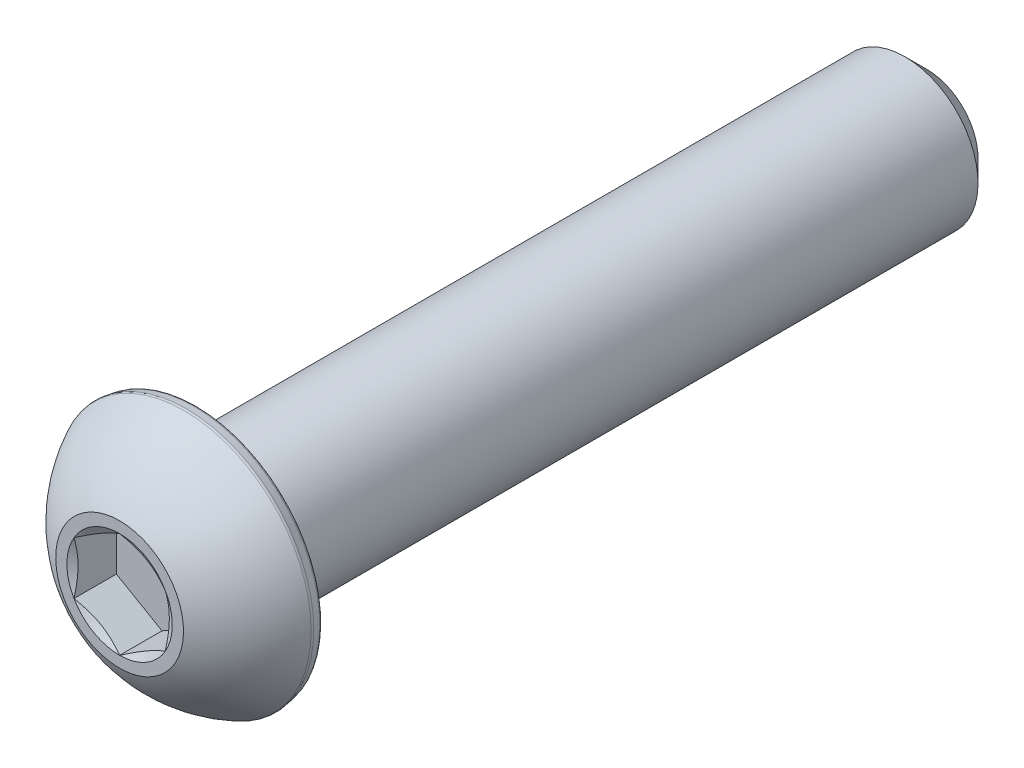
ISO-10303-21;
HEADER;
FILE_DESCRIPTION(('STEP AP214'),'2;1');
FILE_NAME('part.step','',(''),(''),'','','');
FILE_SCHEMA(('AUTOMOTIVE_DESIGN { 1 0 10303 214 1 1 1 1 }'));
ENDSEC;
DATA;
#1=APPLICATION_CONTEXT('core data for automotive mechanical design processes');
#2=APPLICATION_PROTOCOL_DEFINITION('international standard','automotive_design',2000,#1);
#3=PRODUCT_CONTEXT('',#1,'mechanical');
#4=PRODUCT('Part','Part','',(#3));
#5=PRODUCT_RELATED_PRODUCT_CATEGORY('part','',(#4));
#6=PRODUCT_DEFINITION_FORMATION('','',#4);
#7=PRODUCT_DEFINITION_CONTEXT('part definition',#1,'design');
#8=PRODUCT_DEFINITION('design','',#6,#7);
#9=PRODUCT_DEFINITION_SHAPE('','',#8);
#10=(LENGTH_UNIT() NAMED_UNIT(*) SI_UNIT(.MILLI.,.METRE.));
#11=(NAMED_UNIT(*) PLANE_ANGLE_UNIT() SI_UNIT($,.RADIAN.));
#12=(NAMED_UNIT(*) SI_UNIT($,.STERADIAN.) SOLID_ANGLE_UNIT());
#13=UNCERTAINTY_MEASURE_WITH_UNIT(LENGTH_MEASURE(1.E-05),#10,'distance_accuracy_value','');
#14=(GEOMETRIC_REPRESENTATION_CONTEXT(3) GLOBAL_UNCERTAINTY_ASSIGNED_CONTEXT((#13)) GLOBAL_UNIT_ASSIGNED_CONTEXT((#10,
#11,#12)) REPRESENTATION_CONTEXT('',''));
#15=CARTESIAN_POINT('',(0.,0.,0.));
#16=DIRECTION('',(0.,0.,1.));
#17=DIRECTION('',(1.,0.,0.));
#18=AXIS2_PLACEMENT_3D('',#15,#16,#17);
#19=CARTESIAN_POINT('',(0.,2.2225,-31.75));
#20=DIRECTION('',(0.,0.,-1.));
#21=DIRECTION('',(0.,1.,0.));
#22=AXIS2_PLACEMENT_3D('',#19,#20,#21);
#23=PLANE('',#22);
#24=CARTESIAN_POINT('',(0.,0.,-31.75));
#25=DIRECTION('',(0.,0.,-1.));
#26=DIRECTION('',(0.,1.,0.));
#27=AXIS2_PLACEMENT_3D('',#24,#25,#26);
#28=CIRCLE('',#27,2.2225);
#29=CARTESIAN_POINT('',(0.,2.2225,-31.75));
#30=VERTEX_POINT('',#29);
#31=EDGE_CURVE('E109',#30,#30,#28,.T.);
#32=ORIENTED_EDGE('',*,*,#31,.T.);
#33=EDGE_LOOP('',(#32));
#34=FACE_BOUND('',#33,.T.);
#35=ADVANCED_FACE('F40',(#34),#23,.T.);
#36=CARTESIAN_POINT('',(0.,0.,-31.75));
#37=DIRECTION('',(0.,0.,1.));
#38=DIRECTION('',(0.,-1.,0.));
#39=AXIS2_PLACEMENT_3D('',#36,#37,#38);
#40=CONICAL_SURFACE('',#39,2.2225,0.785398163397445);
#41=CARTESIAN_POINT('',(0.,0.,-30.7975));
#42=DIRECTION('',(0.,0.,-1.));
#43=DIRECTION('',(0.,1.,0.));
#44=AXIS2_PLACEMENT_3D('',#41,#42,#43);
#45=CIRCLE('',#44,3.175);
#46=CARTESIAN_POINT('',(0.,3.175,-30.7975));
#47=VERTEX_POINT('',#46);
#48=EDGE_CURVE('E209',#47,#47,#45,.T.);
#49=ORIENTED_EDGE('',*,*,#48,.T.);
#50=EDGE_LOOP('',(#49));
#51=FACE_BOUND('',#50,.T.);
#52=ORIENTED_EDGE('',*,*,#31,.F.);
#53=EDGE_LOOP('',(#52));
#54=FACE_BOUND('',#53,.T.);
#55=ADVANCED_FACE('F267',(#51,#54),#40,.T.);
#56=CARTESIAN_POINT('',(0.,0.,-31.75));
#57=DIRECTION('',(0.,0.,-1.));
#58=DIRECTION('',(0.,1.,0.));
#59=AXIS2_PLACEMENT_3D('',#56,#57,#58);
#60=CYLINDRICAL_SURFACE('',#59,3.175);
#61=CARTESIAN_POINT('',(0.,0.,0.));
#62=DIRECTION('',(0.,0.,-1.));
#63=DIRECTION('',(0.,1.,0.));
#64=AXIS2_PLACEMENT_3D('',#61,#62,#63);
#65=CIRCLE('',#64,3.175);
#66=CARTESIAN_POINT('',(0.,3.175,0.));
#67=VERTEX_POINT('',#66);
#68=EDGE_CURVE('E210',#67,#67,#65,.T.);
#69=ORIENTED_EDGE('',*,*,#68,.T.);
#70=EDGE_LOOP('',(#69));
#71=FACE_BOUND('',#70,.T.);
#72=ORIENTED_EDGE('',*,*,#48,.F.);
#73=EDGE_LOOP('',(#72));
#74=FACE_BOUND('',#73,.T.);
#75=ADVANCED_FACE('F203',(#71,#74),#60,.T.);
#76=CARTESIAN_POINT('',(0.,5.4612216348621,0.));
#77=DIRECTION('',(0.,0.,-1.));
#78=DIRECTION('',(0.,1.,0.));
#79=AXIS2_PLACEMENT_3D('',#76,#77,#78);
#80=PLANE('',#79);
#81=CARTESIAN_POINT('',(0.,0.,0.));
#82=DIRECTION('',(0.,0.,-1.));
#83=DIRECTION('',(0.,1.,0.));
#84=AXIS2_PLACEMENT_3D('',#81,#82,#83);
#85=CIRCLE('',#84,5.32055497269154);
#86=CARTESIAN_POINT('',(0.,5.32055497269154,0.));
#87=VERTEX_POINT('',#86);
#88=EDGE_CURVE('E11',#87,#87,#85,.T.);
#89=ORIENTED_EDGE('',*,*,#88,.T.);
#90=EDGE_LOOP('',(#89));
#91=FACE_BOUND('',#90,.T.);
#92=ORIENTED_EDGE('',*,*,#68,.F.);
#93=EDGE_LOOP('',(#92));
#94=FACE_BOUND('',#93,.T.);
#95=ADVANCED_FACE('F194',(#91,#94),#80,.T.);
#96=CARTESIAN_POINT('',(0.,0.,0.));
#97=DIRECTION('',(0.,0.,1.));
#98=DIRECTION('',(0.,-1.,0.));
#99=AXIS2_PLACEMENT_3D('',#96,#97,#98);
#100=CONICAL_SURFACE('',#99,5.4612216348621,0.174532925199424);
#101=CARTESIAN_POINT('',(0.,0.,0.449969191541055));
#102=DIRECTION('',(0.,0.,-1.));
#103=DIRECTION('',(0.,1.,0.));
#104=AXIS2_PLACEMENT_3D('',#101,#102,#103);
#105=CIRCLE('',#104,5.54056334381836);
#106=CARTESIAN_POINT('',(0.,5.54056334381836,0.449969191541055));
#107=VERTEX_POINT('',#106);
#108=EDGE_CURVE('E180',#107,#107,#105,.T.);
#109=ORIENTED_EDGE('',*,*,#108,.T.);
#110=EDGE_LOOP('',(#109));
#111=FACE_BOUND('',#110,.T.);
#112=CARTESIAN_POINT('',(0.,0.,0.138529619495922));
#113=DIRECTION('',(0.,0.,-1.));
#114=DIRECTION('',(0.,1.,0.));
#115=AXIS2_PLACEMENT_3D('',#112,#113,#114);
#116=CIRCLE('',#115,5.48564814440651);
#117=CARTESIAN_POINT('',(0.,5.48564814440651,0.138529619495922));
#118=VERTEX_POINT('',#117);
#119=EDGE_CURVE('E107',#118,#118,#116,.F.);
#120=ORIENTED_EDGE('',*,*,#119,.T.);
#121=EDGE_LOOP('',(#120));
#122=FACE_BOUND('',#121,.T.);
#123=ADVANCED_FACE('F188',(#111,#122),#100,.T.);
#124=CARTESIAN_POINT('',(0.,0.,-2.12203183656418));
#125=DIRECTION('',(0.,0.,-1.));
#126=DIRECTION('',(0.,1.,0.));
#127=AXIS2_PLACEMENT_3D('',#124,#125,#126);
#128=SPHERICAL_SURFACE('',#127,6.13936170577054);
#129=CARTESIAN_POINT('',(0.,0.,0.552098767852259));
#130=DIRECTION('',(0.,0.,-1.));
#131=DIRECTION('',(0.,1.,0.));
#132=AXIS2_PLACEMENT_3D('',#129,#130,#131);
#133=CIRCLE('',#132,5.5263720165046);
#134=CARTESIAN_POINT('',(0.,5.52637201650459,0.552098767852259));
#135=VERTEX_POINT('',#134);
#136=EDGE_CURVE('E44',#135,#135,#133,.F.);
#137=CARTESIAN_POINT('',(0.,0.,3.3528));
#138=DIRECTION('',(0.,0.,-1.));
#139=DIRECTION('',(0.,1.,0.));
#140=AXIS2_PLACEMENT_3D('',#137,#138,#139);
#141=CIRCLE('',#140,2.778125);
#142=CARTESIAN_POINT('',(0.,2.77812499999999,3.3528));
#143=VERTEX_POINT('',#142);
#144=EDGE_CURVE('E208',#143,#143,#141,.T.);
#145=CARTESIAN_POINT('',(0.,5.52637201650459,0.552098767852259));
#146=CARTESIAN_POINT('',(0.,5.50825080177499,0.589548307182206));
#147=CARTESIAN_POINT('',(0.,5.48974881162674,0.626813592400267));
#148=CARTESIAN_POINT('',(0.,5.45199117255905,0.700960378875296));
#149=CARTESIAN_POINT('',(0.,5.4327355236396,0.737841880132264));
#150=CARTESIAN_POINT('',(0.,5.39347845909561,0.811205822947783));
#151=CARTESIAN_POINT('',(0.,5.37347704347106,0.847688264506334));
#152=CARTESIAN_POINT('',(0.,5.33273672924781,0.920239019608295));
#153=CARTESIAN_POINT('',(0.,5.31199783064911,0.956307333151706));
#154=CARTESIAN_POINT('',(0.,5.26979111662967,1.02801492366803));
#155=CARTESIAN_POINT('',(0.,5.24832330120894,1.06365420064094));
#156=CARTESIAN_POINT('',(0.,5.20466762693299,1.1344889898225));
#157=CARTESIAN_POINT('',(0.,5.18247976807778,1.16968450203113));
#158=CARTESIAN_POINT('',(0.,5.13739317629117,1.23961721606985));
#159=CARTESIAN_POINT('',(0.,5.11449444335977,1.27435441789994));
#160=CARTESIAN_POINT('',(0.,5.06799556699608,1.34335615519477));
#161=CARTESIAN_POINT('',(0.,5.04439542356379,1.37762069065952));
#162=CARTESIAN_POINT('',(0.,4.9965034795341,1.44566293451962));
#163=CARTESIAN_POINT('',(0.,4.9722116789367,1.47944064291497));
#164=CARTESIAN_POINT('',(0.,4.9229464597884,1.54649527314161));
#165=CARTESIAN_POINT('',(0.,4.89797304123748,1.5797721949729));
#166=CARTESIAN_POINT('',(0.,4.84735490708145,1.64581149953536));
#167=CARTESIAN_POINT('',(0.,4.82171019147632,1.67857388226652));
#168=CARTESIAN_POINT('',(0.,4.76976006154396,1.74357056874015));
#169=CARTESIAN_POINT('',(0.,4.74345464721672,1.77580487248262));
#170=CARTESIAN_POINT('',(0.,4.69019399122224,1.83973207933209));
#171=CARTESIAN_POINT('',(0.,4.66323874955498,1.87142498243909));
#172=CARTESIAN_POINT('',(0.,4.6086895788204,1.93425629011852));
#173=CARTESIAN_POINT('',(0.,4.58109564975306,1.96539469469096));
#174=CARTESIAN_POINT('',(0.,4.52528050811203,2.02710413656277));
#175=CARTESIAN_POINT('',(0.,4.49705929553834,2.05767517386215));
#176=CARTESIAN_POINT('',(0.,4.44000125001922,2.11823724692835));
#177=CARTESIAN_POINT('',(0.,4.41116441707378,2.14822828269517));
#178=CARTESIAN_POINT('',(0.,4.35288704836658,2.20761795813715));
#179=CARTESIAN_POINT('',(0.,4.32344651260481,2.23701659781231));
#180=CARTESIAN_POINT('',(0.,4.2639739053159,2.29520933133461));
#181=CARTESIAN_POINT('',(0.,4.23394183378876,2.32400342518176));
#182=CARTESIAN_POINT('',(0.,4.17329856648729,2.38097516715566));
#183=CARTESIAN_POINT('',(0.,4.14268737071296,2.40915281528241));
#184=CARTESIAN_POINT('',(0.,4.08089850577313,2.46488002068504));
#185=CARTESIAN_POINT('',(0.,4.04972083660764,2.49242957796091));
#186=CARTESIAN_POINT('',(0.,3.98681190985103,2.54688921610578));
#187=CARTESIAN_POINT('',(0.,3.95508065225992,2.57379929697477));
#188=CARTESIAN_POINT('',(0.,3.89107766240224,2.62696886102995));
#189=CARTESIAN_POINT('',(0.,3.85880593013566,2.65322834421614));
#190=CARTESIAN_POINT('',(0.,3.79373532804181,2.70508586050525));
#191=CARTESIAN_POINT('',(0.,3.76093645821453,2.73068389360817));
#192=CARTESIAN_POINT('',(0.,3.69482513596821,2.78120793069356));
#193=CARTESIAN_POINT('',(0.,3.66151268354917,2.80613393467603));
#194=CARTESIAN_POINT('',(0.,3.59438796333499,2.8553036122083));
#195=CARTESIAN_POINT('',(0.,3.56057569553984,2.87954728575809));
#196=CARTESIAN_POINT('',(0.,3.49246531836684,2.92734228313378));
#197=CARTESIAN_POINT('',(0.,3.45816720898898,2.95089360695968));
#198=CARTESIAN_POINT('',(0.,3.3890993231695,2.99729417161336));
#199=CARTESIAN_POINT('',(0.,3.35432954672786,3.02014341244114));
#200=CARTESIAN_POINT('',(0.,3.28433269645534,3.06513036840404));
#201=CARTESIAN_POINT('',(0.,3.24910562262445,3.08726808353916));
#202=CARTESIAN_POINT('',(0.,3.17820873538992,3.13082283788848));
#203=CARTESIAN_POINT('',(0.,3.14253892198628,3.15223987710268));
#204=CARTESIAN_POINT('',(0.,3.07077129956019,3.19434443315283));
#205=CARTESIAN_POINT('',(0.,3.03467349053774,3.21503194998879));
#206=CARTESIAN_POINT('',(0.,2.96206478589976,3.25566889417563));
#207=CARTESIAN_POINT('',(0.,2.92555389028423,3.27561832152652));
#208=CARTESIAN_POINT('',(0.,2.8521341362735,3.31477090731015));
#209=CARTESIAN_POINT('',(0.,2.81522527787831,3.33397406574288));
#210=CARTESIAN_POINT('',(0.,2.77812499999999,3.3528));
#211=B_SPLINE_CURVE_WITH_KNOTS('',3,(#145,#146,#147,#148,#149,#150,#151,#152,#153,#154,#155,
#156,#157,#158,#159,#160,#161,#162,#163,#164,#165,#166,#167,#168,#169,#170,#171,#172,#173,#174,
#175,#176,#177,#178,#179,#180,#181,#182,#183,#184,#185,#186,#187,#188,#189,#190,#191,#192,#193,
#194,#195,#196,#197,#198,#199,#200,#201,#202,#203,#204,#205,#206,#207,#208,#209,#210),
.UNSPECIFIED.,.F.,.F.,(4,2,2,2,2,2,2,2,2,2,2,2,2,2,2,2,2,2,2,2,2,2,2,2,2,2,2,2,2,2,2,2,4),(0.,
0.124808174209305,0.24961634841861,0.374424522627915,0.49923269683722,0.624040871046526,
0.748849045255831,0.873657219465135,0.998465393674441,1.12327356788375,1.24808174209305,
1.37288991630236,1.49769809051166,1.62250626472097,1.74731443893027,1.87212261313958,
1.99693078734888,2.12173896155819,2.24654713576749,2.3713553099768,2.4961634841861,
2.62097165839541,2.74577983260471,2.87058800681402,2.99539618102332,3.12020435523263,
3.24501252944193,3.36982070365124,3.49462887786054,3.61943705206985,3.74424522627915,
3.86905340048846,3.99386157469776),.UNSPECIFIED.);
#212=EDGE_CURVE('BSEAM185',#135,#143,#211,.T.);
#213=ORIENTED_EDGE('',*,*,#136,.T.);
#214=ORIENTED_EDGE('',*,*,#144,.T.);
#215=ORIENTED_EDGE('',*,*,#212,.T.);
#216=ORIENTED_EDGE('',*,*,#212,.F.);
#217=EDGE_LOOP('',(#213,#215,#214,#216));
#218=FACE_BOUND('',#217,.T.);
#219=ADVANCED_FACE('F185',(#218),#128,.T.);
#220=CARTESIAN_POINT('',(0.,0.,3.3528));
#221=DIRECTION('',(0.,0.,1.));
#222=DIRECTION('',(0.,-1.,0.));
#223=AXIS2_PLACEMENT_3D('',#220,#221,#222);
#224=PLANE('',#223);
#225=CARTESIAN_POINT('',(0.,0.,3.3528));
#226=DIRECTION('',(0.,0.,1.));
#227=DIRECTION('',(1.,0.,0.));
#228=AXIS2_PLACEMENT_3D('',#225,#226,#227);
#229=CIRCLE('',#228,2.29135888084633);
#230=CARTESIAN_POINT('',(0.,-2.29135888084633,3.3528));
#231=VERTEX_POINT('',#230);
#232=CARTESIAN_POINT('',(1.984375,-1.14567944042316,3.3528));
#233=VERTEX_POINT('',#232);
#234=EDGE_CURVE('E59',#231,#233,#229,.T.);
#235=ORIENTED_EDGE('',*,*,#234,.F.);
#236=CARTESIAN_POINT('',(-1.984375,-1.14567944042316,3.3528));
#237=VERTEX_POINT('',#236);
#238=EDGE_CURVE('E133',#237,#231,#229,.T.);
#239=ORIENTED_EDGE('',*,*,#238,.F.);
#240=CARTESIAN_POINT('',(-1.984375,1.14567944042316,3.3528));
#241=VERTEX_POINT('',#240);
#242=EDGE_CURVE('E131',#241,#237,#229,.T.);
#243=ORIENTED_EDGE('',*,*,#242,.F.);
#244=CARTESIAN_POINT('',(0.,2.29135888084633,3.3528));
#245=VERTEX_POINT('',#244);
#246=EDGE_CURVE('E100',#245,#241,#229,.T.);
#247=ORIENTED_EDGE('',*,*,#246,.F.);
#248=CARTESIAN_POINT('',(1.984375,1.14567944042316,3.3528));
#249=VERTEX_POINT('',#248);
#250=EDGE_CURVE('E87',#249,#245,#229,.T.);
#251=ORIENTED_EDGE('',*,*,#250,.F.);
#252=EDGE_CURVE('E51',#233,#249,#229,.T.);
#253=ORIENTED_EDGE('',*,*,#252,.F.);
#254=EDGE_LOOP('',(#235,#239,#243,#247,#251,#253));
#255=FACE_BOUND('',#254,.T.);
#256=ORIENTED_EDGE('',*,*,#144,.F.);
#257=EDGE_LOOP('',(#256));
#258=FACE_BOUND('',#257,.T.);
#259=ADVANCED_FACE('F128',(#255,#258),#224,.T.);
#260=CARTESIAN_POINT('',(0.,0.,3.3528));
#261=DIRECTION('',(0.,0.,1.));
#262=DIRECTION('',(1.,0.,0.));
#263=AXIS2_PLACEMENT_3D('',#260,#261,#262);
#264=CONICAL_SURFACE('',#263,2.29135888084633,1.0471975511966);
#265=ORIENTED_EDGE('',*,*,#246,.T.);
#266=CARTESIAN_POINT('',(0.000199999999998985,2.29147435090016,3.35286667170578));
#267=CARTESIAN_POINT('',(-0.0870046387806774,2.24112672922556,3.32378568224019));
#268=CARTESIAN_POINT('',(-0.174962019304997,2.19034451190263,3.29733720802705));
#269=CARTESIAN_POINT('',(-0.35239997867232,2.08790065829744,3.25117027120647));
#270=CARTESIAN_POINT('',(-0.441883711256319,2.03623720120198,3.23146814224896));
#271=CARTESIAN_POINT('',(-0.619742148012469,1.93355058486317,3.20079773193153));
#272=CARTESIAN_POINT('',(-0.708089480306093,1.88254322878126,3.18962534272021));
#273=CARTESIAN_POINT('',(-0.885200028110949,1.7802884063298,3.17628579605442));
#274=CARTESIAN_POINT('',(-0.973962599510546,1.72904131183828,3.17410759446012));
#275=CARTESIAN_POINT('',(-1.13983230286466,1.63327639395638,3.17862955150835));
#276=CARTESIAN_POINT('',(-1.21696421566591,1.58874426333747,3.18421941345587));
#277=CARTESIAN_POINT('',(-1.37072550718908,1.49997014028562,3.20193893389701));
#278=CARTESIAN_POINT('',(-1.44735435374552,1.45572845509857,3.21407465032952));
#279=CARTESIAN_POINT('',(-1.60143288850678,1.36677117157781,3.24441415884436));
#280=CARTESIAN_POINT('',(-1.67886306721268,1.32206683705856,3.26274660929099));
#281=CARTESIAN_POINT('',(-1.83256831124359,1.23332507304146,3.30435450640018));
#282=CARTESIAN_POINT('',(-1.90884534705293,1.18928650588395,3.32762017128238));
#283=CARTESIAN_POINT('',(-1.984575,1.14556397036932,3.35286667170578));
#284=B_SPLINE_CURVE_WITH_KNOTS('',3,(#266,#267,#268,#269,#270,#271,#272,#273,#274,#275,#276,
#277,#278,#279,#280,#281,#282,#283),.UNSPECIFIED.,.F.,.F.,(4,2,2,2,2,2,2,2,4),(0.,
0.314555137114085,0.629866549668806,0.937373439505932,1.24450262309398,1.51196650590478,
1.77967834211415,2.05332989762155,2.32644383656793),.UNSPECIFIED.);
#285=EDGE_CURVE('E104',#245,#241,#284,.T.);
#286=ORIENTED_EDGE('',*,*,#285,.F.);
#287=EDGE_LOOP('',(#265,#286));
#288=FACE_BOUND('',#287,.T.);
#289=ADVANCED_FACE('F102',(#288),#264,.F.);
#290=ORIENTED_EDGE('',*,*,#242,.T.);
#291=CARTESIAN_POINT('',(-1.984375,-2.96692860034507,4.09066065109238));
#292=CARTESIAN_POINT('',(-1.984375,-2.88123645369667,4.04954880177529));
#293=CARTESIAN_POINT('',(-1.984375,-2.79533554929687,4.00886397295606));
#294=CARTESIAN_POINT('',(-1.984375,-2.62300496253372,3.92859059794519));
#295=CARTESIAN_POINT('',(-1.984375,-2.53657518838115,3.88900224904708));
#296=CARTESIAN_POINT('',(-1.984375,-2.36258003650985,3.8109429144296));
#297=CARTESIAN_POINT('',(-1.984375,-2.27501095051754,3.77248016339895));
#298=CARTESIAN_POINT('',(-1.984375,-2.09913795632987,3.69727942709752));
#299=CARTESIAN_POINT('',(-1.984375,-2.01083408662377,3.66054135214645));
#300=CARTESIAN_POINT('',(-1.984375,-1.83102497893539,3.58831372935496));
#301=CARTESIAN_POINT('',(-1.984375,-1.73949640320228,3.55288193907389));
#302=CARTESIAN_POINT('',(-1.984375,-1.55533214713673,3.48496418355678));
#303=CARTESIAN_POINT('',(-1.984375,-1.46269633980312,3.45247855999265));
#304=CARTESIAN_POINT('',(-1.984375,-1.27638419434466,3.39138213635921));
#305=CARTESIAN_POINT('',(-1.984375,-1.18271082678456,3.3627623752382));
#306=CARTESIAN_POINT('',(-1.984375,-0.994021652382588,3.31037636886058));
#307=CARTESIAN_POINT('',(-1.984375,-0.899006185229732,3.28660891819845));
#308=CARTESIAN_POINT('',(-1.984375,-0.70783051245842,3.24519473938057));
#309=CARTESIAN_POINT('',(-1.984375,-0.611673084373239,3.22753544006603));
#310=CARTESIAN_POINT('',(-1.984375,-0.418283092113672,3.19949309653349));
#311=CARTESIAN_POINT('',(-1.984375,-0.32105060104525,3.18910956060593));
#312=CARTESIAN_POINT('',(-1.984375,-0.127210752774483,3.1765852009906));
#313=CARTESIAN_POINT('',(-1.984375,-0.0306098639781233,3.17434710736856));
#314=CARTESIAN_POINT('',(-1.984375,0.162431915887106,3.17804204703217));
#315=CARTESIAN_POINT('',(-1.984375,0.258872796678698,3.18397558627506));
#316=CARTESIAN_POINT('',(-1.984375,0.496826477184734,3.20817557369152));
#317=CARTESIAN_POINT('',(-1.984375,0.637878211825128,3.23097722021417));
#318=CARTESIAN_POINT('',(-1.984375,0.917238703702529,3.28977602426137));
#319=CARTESIAN_POINT('',(-1.984375,1.05554394232965,3.32578908554252));
#320=CARTESIAN_POINT('',(-1.984375,1.26239464896717,3.38730820789035));
#321=CARTESIAN_POINT('',(-1.984375,1.33200934564274,3.40935142641455));
#322=CARTESIAN_POINT('',(-1.984375,1.47051409380588,3.4554769862575));
#323=CARTESIAN_POINT('',(-1.984375,1.53940456776433,3.47955805500612));
#324=CARTESIAN_POINT('',(-1.984375,1.67655293465251,3.52940958868946));
#325=CARTESIAN_POINT('',(-1.984375,1.74481093998431,3.55517974660228));
#326=CARTESIAN_POINT('',(-1.984375,1.88078910071683,3.60813071268156));
#327=CARTESIAN_POINT('',(-1.984375,1.94850916300286,3.63531175918296));
#328=CARTESIAN_POINT('',(-1.984375,2.12136731788458,3.70643362383593));
#329=CARTESIAN_POINT('',(-1.984375,2.22615977384556,3.75121359670133));
#330=CARTESIAN_POINT('',(-1.984375,2.43479837304526,3.84293219568247));
#331=CARTESIAN_POINT('',(-1.984375,2.5386444446916,3.88987098351125));
#332=CARTESIAN_POINT('',(-1.984375,2.84907841644385,4.03316456132352));
#333=CARTESIAN_POINT('',(-1.984375,3.05452739791262,4.13198187526435));
#334=CARTESIAN_POINT('',(-1.984375,3.46367014223902,4.33376088572476));
#335=CARTESIAN_POINT('',(-1.984375,3.66736143684957,4.43672752775299));
#336=CARTESIAN_POINT('',(-1.984375,4.0733484486621,4.64530841655482));
#337=CARTESIAN_POINT('',(-1.984375,4.27564433912762,4.75092232679349));
#338=CARTESIAN_POINT('',(-1.984375,4.66022184962415,4.95391933686162));
#339=CARTESIAN_POINT('',(-1.984375,4.84259034249047,5.05113842729249));
#340=CARTESIAN_POINT('',(-1.984375,5.20674070245669,5.24668432048827));
#341=CARTESIAN_POINT('',(-1.984375,5.3885225475248,5.34501116424655));
#342=CARTESIAN_POINT('',(-1.984375,5.7511724793118,5.54224361750704));
#343=CARTESIAN_POINT('',(-1.984375,5.93204171415672,5.6411471187779));
#344=CARTESIAN_POINT('',(-1.984375,6.29341450955435,5.83959783989033));
#345=CARTESIAN_POINT('',(-1.984375,6.47391808874827,5.9391450257738));
#346=CARTESIAN_POINT('',(-1.984375,6.65429029614519,6.03892825226339));
#347=B_SPLINE_CURVE_WITH_KNOTS('',3,(#291,#292,#293,#294,#295,#296,#297,#298,#299,#300,#301,
#302,#303,#304,#305,#306,#307,#308,#309,#310,#311,#312,#313,#314,#315,#316,#317,#318,#319,#320,
#321,#322,#323,#324,#325,#326,#327,#328,#329,#330,#331,#332,#333,#334,#335,#336,#337,#338,#339,
#340,#341,#342,#343,#344,#345,#346),.UNSPECIFIED.,.F.,.F.,(4,2,2,2,2,2,2,2,2,2,2,2,2,2,2,2,2,2,
2,2,2,2,2,2,2,2,2,4),(0.,0.285135519832374,0.570322016122789,0.857238463819793,1.14413997577449,
1.43854271801315,1.7329795590899,2.02672173491208,2.32039085060263,2.61345191984504,
2.90649318156653,3.19602335108128,3.48557144803805,3.91334047285799,4.34162614021154,
4.56066589824458,4.77956986852721,4.99843415889189,5.21733554208812,5.55917796423187,
5.90104603503021,6.58489509249957,7.26958483186157,7.95418796687477,8.57417425374277,
9.1941835596094,9.81261585701216,10.431015790458),.UNSPECIFIED.);
#348=EDGE_CURVE('E96',#241,#237,#347,.F.);
#349=ORIENTED_EDGE('',*,*,#348,.F.);
#350=EDGE_LOOP('',(#290,#349));
#351=FACE_BOUND('',#350,.T.);
#352=ADVANCED_FACE('F284',(#351),#264,.F.);
#353=ORIENTED_EDGE('',*,*,#238,.T.);
#354=CARTESIAN_POINT('',(-1.984575,-1.14556397036933,3.35286667170578));
#355=CARTESIAN_POINT('',(-1.89737036121932,-1.19591159204393,3.32378568224019));
#356=CARTESIAN_POINT('',(-1.809412980695,-1.24669380936686,3.29733720802705));
#357=CARTESIAN_POINT('',(-1.63197502132768,-1.34913766297205,3.25117027120647));
#358=CARTESIAN_POINT('',(-1.54249128874368,-1.40080112006751,3.23146814224896));
#359=CARTESIAN_POINT('',(-1.36463285198753,-1.50348773640632,3.20079773193153));
#360=CARTESIAN_POINT('',(-1.27628551969391,-1.55449509248823,3.18962534272021));
#361=CARTESIAN_POINT('',(-1.09917497188905,-1.65674991493968,3.17628579605442));
#362=CARTESIAN_POINT('',(-1.01041240048945,-1.7079970094312,3.17410759446012));
#363=CARTESIAN_POINT('',(-0.844542697135338,-1.80376192731311,3.17862955150835));
#364=CARTESIAN_POINT('',(-0.767410784334092,-1.84829405793202,3.18421941345587));
#365=CARTESIAN_POINT('',(-0.613649492810918,-1.93706818098386,3.20193893389701));
#366=CARTESIAN_POINT('',(-0.537020646254475,-1.98130986617092,3.21407465032952));
#367=CARTESIAN_POINT('',(-0.382942111493216,-2.07026714969167,3.24441415884436));
#368=CARTESIAN_POINT('',(-0.305511932787316,-2.11497148421093,3.26274660929099));
#369=CARTESIAN_POINT('',(-0.15180668875641,-2.20371324822803,3.30435450640018));
#370=CARTESIAN_POINT('',(-0.075529652947066,-2.24775181538554,3.32762017128238));
#371=CARTESIAN_POINT('',(0.000200000000001756,-2.29147435090016,3.35286667170578));
#372=B_SPLINE_CURVE_WITH_KNOTS('',3,(#354,#355,#356,#357,#358,#359,#360,#361,#362,#363,#364,
#365,#366,#367,#368,#369,#370,#371),.UNSPECIFIED.,.F.,.F.,(4,2,2,2,2,2,2,2,4),(0.,
0.314555137114085,0.629866549668806,0.937373439505933,1.24450262309398,1.51196650590478,
1.77967834211415,2.05332989762155,2.32644383656793),.UNSPECIFIED.);
#373=EDGE_CURVE('E143',#237,#231,#372,.T.);
#374=ORIENTED_EDGE('',*,*,#373,.F.);
#375=EDGE_LOOP('',(#353,#374));
#376=FACE_BOUND('',#375,.T.);
#377=ADVANCED_FACE('F289',(#376),#264,.F.);
#378=ORIENTED_EDGE('',*,*,#234,.T.);
#379=CARTESIAN_POINT('',(-0.000199999999998362,-2.29147435090016,3.35286667170578));
#380=CARTESIAN_POINT('',(0.0870046387806782,-2.24112672922556,3.32378568224019));
#381=CARTESIAN_POINT('',(0.174962019304998,-2.19034451190263,3.29733720802705));
#382=CARTESIAN_POINT('',(0.352399978672321,-2.08790065829744,3.25117027120647));
#383=CARTESIAN_POINT('',(0.44188371125632,-2.03623720120198,3.23146814224896));
#384=CARTESIAN_POINT('',(0.619742148012469,-1.93355058486317,3.20079773193153));
#385=CARTESIAN_POINT('',(0.708089480306094,-1.88254322878126,3.18962534272021));
#386=CARTESIAN_POINT('',(0.88520002811095,-1.78028840632981,3.17628579605442));
#387=CARTESIAN_POINT('',(0.973962599510547,-1.72904131183828,3.17410759446012));
#388=CARTESIAN_POINT('',(1.13983230286466,-1.63327639395638,3.17862955150835));
#389=CARTESIAN_POINT('',(1.21696421566591,-1.58874426333747,3.18421941345587));
#390=CARTESIAN_POINT('',(1.37072550718908,-1.49997014028562,3.20193893389701));
#391=CARTESIAN_POINT('',(1.44735435374552,-1.45572845509857,3.21407465032952));
#392=CARTESIAN_POINT('',(1.60143288850678,-1.36677117157782,3.24441415884436));
#393=CARTESIAN_POINT('',(1.67886306721268,-1.32206683705856,3.26274660929099));
#394=CARTESIAN_POINT('',(1.83256831124359,-1.23332507304146,3.30435450640018));
#395=CARTESIAN_POINT('',(1.90884534705293,-1.18928650588395,3.32762017128238));
#396=CARTESIAN_POINT('',(1.984575,-1.14556397036933,3.35286667170578));
#397=B_SPLINE_CURVE_WITH_KNOTS('',3,(#379,#380,#381,#382,#383,#384,#385,#386,#387,#388,#389,
#390,#391,#392,#393,#394,#395,#396),.UNSPECIFIED.,.F.,.F.,(4,2,2,2,2,2,2,2,4),(0.,
0.314555137114086,0.629866549668806,0.937373439505932,1.24450262309398,1.51196650590478,
1.77967834211415,2.05332989762155,2.32644383656793),.UNSPECIFIED.);
#398=EDGE_CURVE('E247',#231,#233,#397,.T.);
#399=ORIENTED_EDGE('',*,*,#398,.F.);
#400=EDGE_LOOP('',(#378,#399));
#401=FACE_BOUND('',#400,.T.);
#402=ADVANCED_FACE('F298',(#401),#264,.F.);
#403=ORIENTED_EDGE('',*,*,#252,.T.);
#404=CARTESIAN_POINT('',(1.984375,-2.96692860141219,4.09066065160449));
#405=CARTESIAN_POINT('',(1.984375,-2.88123645472732,4.04954880226534));
#406=CARTESIAN_POINT('',(1.984375,-2.79533555029103,4.00886397342406));
#407=CARTESIAN_POINT('',(1.984375,-2.62300496345475,3.92859059836923));
#408=CARTESIAN_POINT('',(1.984375,-2.53657518926555,3.88900224944919));
#409=CARTESIAN_POINT('',(1.984375,-2.36258003732029,3.81094291478783));
#410=CARTESIAN_POINT('',(1.984375,-2.27501095129065,3.77248016373523));
#411=CARTESIAN_POINT('',(1.984375,-2.09913795702803,3.69727942739033));
#412=CARTESIAN_POINT('',(1.984375,-2.01083408728431,3.66054135241773));
#413=CARTESIAN_POINT('',(1.984375,-1.83102497951849,3.58831372958307));
#414=CARTESIAN_POINT('',(1.984375,-1.73949640374555,3.55288193928038));
#415=CARTESIAN_POINT('',(1.984375,-1.55533214759963,3.48496418372135));
#416=CARTESIAN_POINT('',(1.984375,-1.46269634022548,3.45247856013692));
#417=CARTESIAN_POINT('',(1.984375,-1.27638419468518,3.39138213646512));
#418=CARTESIAN_POINT('',(1.984375,-1.18271082708378,3.36276237532604));
#419=CARTESIAN_POINT('',(1.984375,-0.994021652598049,3.31037636891564));
#420=CARTESIAN_POINT('',(1.984375,-0.899006185402726,3.28660891823881));
#421=CARTESIAN_POINT('',(1.984375,-0.707830512533289,3.24519473939392));
#422=CARTESIAN_POINT('',(1.984375,-0.611673084392285,3.22753544006783));
#423=CARTESIAN_POINT('',(1.984375,-0.418283092019903,3.19949309652086));
#424=CARTESIAN_POINT('',(1.984375,-0.321050600894491,3.1891095605904));
#425=CARTESIAN_POINT('',(1.984375,-0.1272107525108,3.17658520097928));
#426=CARTESIAN_POINT('',(1.984375,-0.0306098636585145,3.17434710736418));
#427=CARTESIAN_POINT('',(1.984375,0.162431916317516,3.17804204705093));
#428=CARTESIAN_POINT('',(1.984375,0.258872797163983,3.18397558631003));
#429=CARTESIAN_POINT('',(1.984375,0.496826477759218,3.20817557377113));
#430=CARTESIAN_POINT('',(1.984375,0.637878212433304,3.23097722032126));
#431=CARTESIAN_POINT('',(1.984375,0.917238704375943,3.28977602442423));
#432=CARTESIAN_POINT('',(1.984375,1.05554394303461,3.32578908573368));
#433=CARTESIAN_POINT('',(1.984375,1.2623946497194,3.38730820812349));
#434=CARTESIAN_POINT('',(1.984375,1.33200934641104,3.40935142666181));
#435=CARTESIAN_POINT('',(1.984375,1.47051409460615,3.45547698653263));
#436=CARTESIAN_POINT('',(1.984375,1.53940456858051,3.47955805529501));
#437=CARTESIAN_POINT('',(1.984375,1.67655293550043,3.52940958900545));
#438=CARTESIAN_POINT('',(1.984375,1.74481094084806,3.55517974693163));
#439=CARTESIAN_POINT('',(1.984375,1.88078910161224,3.60813071303724));
#440=CARTESIAN_POINT('',(1.984375,1.94850916391411,3.63531175955162));
#441=CARTESIAN_POINT('',(1.984375,2.12136731880634,3.70643362422501));
#442=CARTESIAN_POINT('',(1.984375,2.22615977476235,3.75121359709679));
#443=CARTESIAN_POINT('',(1.984375,2.43479837395273,3.84293219608892));
#444=CARTESIAN_POINT('',(1.984375,2.53864444559471,3.88987098392231));
#445=CARTESIAN_POINT('',(1.984375,2.84907841733456,4.03316456174645));
#446=CARTESIAN_POINT('',(1.984375,3.05452739879602,4.13198187569265));
#447=CARTESIAN_POINT('',(1.984375,3.4636701431087,4.33376088616096));
#448=CARTESIAN_POINT('',(1.984375,3.66736143771284,4.43672752819169));
#449=CARTESIAN_POINT('',(1.984375,4.07334844951337,4.64530841699697));
#450=CARTESIAN_POINT('',(1.984375,4.27564433997329,4.75092232723658));
#451=CARTESIAN_POINT('',(1.984375,4.66022185046472,4.95391933730827));
#452=CARTESIAN_POINT('',(1.984375,4.84259034333148,5.05113842774189));
#453=CARTESIAN_POINT('',(1.984375,5.2067407032988,5.24668432094268));
#454=CARTESIAN_POINT('',(1.984375,5.38852254836759,5.34501116470323));
#455=CARTESIAN_POINT('',(1.984375,5.75117248015673,5.54224361796825));
#456=CARTESIAN_POINT('',(1.984375,5.93204171500312,5.64114711924138));
#457=CARTESIAN_POINT('',(1.984375,6.29341451040382,5.83959784035812));
#458=CARTESIAN_POINT('',(1.984375,6.47391808959935,5.93914502624362));
#459=CARTESIAN_POINT('',(1.984375,6.65429029699792,6.03892825273518));
#460=B_SPLINE_CURVE_WITH_KNOTS('',3,(#404,#405,#406,#407,#408,#409,#410,#411,#412,#413,#414,
#415,#416,#417,#418,#419,#420,#421,#422,#423,#424,#425,#426,#427,#428,#429,#430,#431,#432,#433,
#434,#435,#436,#437,#438,#439,#440,#441,#442,#443,#444,#445,#446,#447,#448,#449,#450,#451,#452,
#453,#454,#455,#456,#457,#458,#459),.UNSPECIFIED.,.F.,.F.,(4,2,2,2,2,2,2,2,2,2,2,2,2,2,2,2,2,2,
2,2,2,2,2,2,2,2,2,4),(0.,0.285135519959645,0.570322016377352,0.857238464203373,1.14413997628707,
1.43854271866057,1.73297955987221,2.02672173582863,2.32039085165331,2.61345192106629,
2.90649318295812,3.1960233526395,3.48557144976305,3.9133404746958,4.34162614216248,
4.56066590025427,4.77956987059558,4.99843416101885,5.21733554427368,5.5591779664113,
5.90104603720346,6.58489509466017,7.26958483400843,7.95418796900807,8.57417425588111,
9.19418356175274,9.81261585916263,10.4310157926157),.UNSPECIFIED.);
#461=EDGE_CURVE('E119',#233,#249,#460,.T.);
#462=ORIENTED_EDGE('',*,*,#461,.F.);
#463=EDGE_LOOP('',(#403,#462));
#464=FACE_BOUND('',#463,.T.);
#465=ADVANCED_FACE('F293',(#464),#264,.F.);
#466=ORIENTED_EDGE('',*,*,#250,.T.);
#467=CARTESIAN_POINT('',(1.984575,1.14556397036933,3.35286667170578));
#468=CARTESIAN_POINT('',(1.89737036121932,1.19591159204393,3.32378568224019));
#469=CARTESIAN_POINT('',(1.809412980695,1.24669380936686,3.29733720802705));
#470=CARTESIAN_POINT('',(1.63197502132768,1.34913766297205,3.25117027120647));
#471=CARTESIAN_POINT('',(1.54249128874368,1.40080112006751,3.23146814224896));
#472=CARTESIAN_POINT('',(1.36463285198753,1.50348773640632,3.20079773193153));
#473=CARTESIAN_POINT('',(1.27628551969391,1.55449509248823,3.18962534272021));
#474=CARTESIAN_POINT('',(1.09917497188905,1.65674991493968,3.17628579605443));
#475=CARTESIAN_POINT('',(1.01041240048945,1.7079970094312,3.17410759446012));
#476=CARTESIAN_POINT('',(0.844542697135338,1.80376192731311,3.17862955150835));
#477=CARTESIAN_POINT('',(0.767410784334093,1.84829405793202,3.18421941345587));
#478=CARTESIAN_POINT('',(0.613649492810918,1.93706818098386,3.20193893389701));
#479=CARTESIAN_POINT('',(0.537020646254475,1.98130986617092,3.21407465032952));
#480=CARTESIAN_POINT('',(0.382942111493216,2.07026714969167,3.24441415884436));
#481=CARTESIAN_POINT('',(0.305511932787317,2.11497148421092,3.26274660929099));
#482=CARTESIAN_POINT('',(0.151806688756411,2.20371324822803,3.30435450640018));
#483=CARTESIAN_POINT('',(0.0755296529470667,2.24775181538554,3.32762017128238));
#484=CARTESIAN_POINT('',(-0.000200000000000885,2.29147435090016,3.35286667170578));
#485=B_SPLINE_CURVE_WITH_KNOTS('',3,(#467,#468,#469,#470,#471,#472,#473,#474,#475,#476,#477,
#478,#479,#480,#481,#482,#483,#484),.UNSPECIFIED.,.F.,.F.,(4,2,2,2,2,2,2,2,4),(0.,
0.314555137114085,0.629866549668806,0.937373439505933,1.24450262309398,1.51196650590478,
1.77967834211415,2.05332989762155,2.32644383656793),.UNSPECIFIED.);
#486=EDGE_CURVE('E91',#249,#245,#485,.T.);
#487=ORIENTED_EDGE('',*,*,#486,.F.);
#488=EDGE_LOOP('',(#466,#487));
#489=FACE_BOUND('',#488,.T.);
#490=ADVANCED_FACE('F95',(#489),#264,.F.);
#491=CARTESIAN_POINT('',(0.,0.,1.50876));
#492=DIRECTION('',(0.,0.,1.));
#493=DIRECTION('',(1.,0.,0.));
#494=AXIS2_PLACEMENT_3D('',#491,#492,#493);
#495=PLANE('',#494);
#496=DIRECTION('',(-0.866025403784439,0.499999999999999,0.));
#497=VECTOR('',#496,1.);
#498=CARTESIAN_POINT('',(1.984375,1.14567944042316,1.50876));
#499=LINE('',#498,#497);
#500=CARTESIAN_POINT('',(1.984375,1.14567944042316,1.50876));
#501=VERTEX_POINT('',#500);
#502=CARTESIAN_POINT('',(0.,2.29135888084633,1.50876));
#503=VERTEX_POINT('',#502);
#504=EDGE_CURVE('E118',#501,#503,#499,.T.);
#505=ORIENTED_EDGE('',*,*,#504,.T.);
#506=DIRECTION('',(-0.866025403784438,-0.5,0.));
#507=VECTOR('',#506,1.);
#508=CARTESIAN_POINT('',(0.,2.29135888084633,1.50876));
#509=LINE('',#508,#507);
#510=CARTESIAN_POINT('',(-1.984375,1.14567944042316,1.50876));
#511=VERTEX_POINT('',#510);
#512=EDGE_CURVE('E121',#503,#511,#509,.T.);
#513=ORIENTED_EDGE('',*,*,#512,.T.);
#514=DIRECTION('',(0.,-1.,0.));
#515=VECTOR('',#514,1.);
#516=CARTESIAN_POINT('',(-1.984375,1.14567944042316,1.50876));
#517=LINE('',#516,#515);
#518=CARTESIAN_POINT('',(-1.984375,-1.14567944042316,1.50876));
#519=VERTEX_POINT('',#518);
#520=EDGE_CURVE('E234',#511,#519,#517,.T.);
#521=ORIENTED_EDGE('',*,*,#520,.T.);
#522=DIRECTION('',(0.866025403784439,-0.499999999999999,0.));
#523=VECTOR('',#522,1.);
#524=CARTESIAN_POINT('',(-1.984375,-1.14567944042316,1.50876));
#525=LINE('',#524,#523);
#526=CARTESIAN_POINT('',(0.,-2.29135888084633,1.50876));
#527=VERTEX_POINT('',#526);
#528=EDGE_CURVE('E233',#519,#527,#525,.T.);
#529=ORIENTED_EDGE('',*,*,#528,.T.);
#530=DIRECTION('',(0.866025403784439,0.5,0.));
#531=VECTOR('',#530,1.);
#532=CARTESIAN_POINT('',(0.,-2.29135888084633,1.50876));
#533=LINE('',#532,#531);
#534=CARTESIAN_POINT('',(1.984375,-1.14567944042316,1.50876));
#535=VERTEX_POINT('',#534);
#536=EDGE_CURVE('E226',#527,#535,#533,.T.);
#537=ORIENTED_EDGE('',*,*,#536,.T.);
#538=DIRECTION('',(0.,1.,0.));
#539=VECTOR('',#538,1.);
#540=CARTESIAN_POINT('',(1.984375,-1.14567944042316,1.50876));
#541=LINE('',#540,#539);
#542=EDGE_CURVE('E130',#535,#501,#541,.T.);
#543=ORIENTED_EDGE('',*,*,#542,.T.);
#544=EDGE_LOOP('',(#505,#513,#521,#529,#537,#543));
#545=FACE_BOUND('',#544,.T.);
#546=ADVANCED_FACE('F164',(#545),#495,.T.);
#547=CARTESIAN_POINT('',(0.,2.29135888084633,1.50876));
#548=DIRECTION('',(-0.500000000000001,0.866025403784438,0.));
#549=DIRECTION('',(-0.866025403784438,-0.500000000000001,0.));
#550=AXIS2_PLACEMENT_3D('',#547,#548,#549);
#551=PLANE('',#550);
#552=DIRECTION('',(0.,0.,1.));
#553=VECTOR('',#552,1.);
#554=CARTESIAN_POINT('',(0.,2.29135888084633,1.50876));
#555=LINE('',#554,#553);
#556=EDGE_CURVE('E116',#503,#245,#555,.T.);
#557=ORIENTED_EDGE('',*,*,#556,.T.);
#558=ORIENTED_EDGE('',*,*,#285,.T.);
#559=DIRECTION('',(0.,0.,1.));
#560=VECTOR('',#559,1.);
#561=CARTESIAN_POINT('',(-1.984375,1.14567944042316,1.50876));
#562=LINE('',#561,#560);
#563=EDGE_CURVE('E127',#511,#241,#562,.T.);
#564=ORIENTED_EDGE('',*,*,#563,.F.);
#565=ORIENTED_EDGE('',*,*,#512,.F.);
#566=EDGE_LOOP('',(#557,#558,#564,#565));
#567=FACE_BOUND('',#566,.T.);
#568=ADVANCED_FACE('F125',(#567),#551,.F.);
#569=CARTESIAN_POINT('',(-1.984375,1.14567944042316,1.50876));
#570=DIRECTION('',(-1.,0.,0.));
#571=DIRECTION('',(0.,0.,1.));
#572=AXIS2_PLACEMENT_3D('',#569,#570,#571);
#573=PLANE('',#572);
#574=ORIENTED_EDGE('',*,*,#563,.T.);
#575=ORIENTED_EDGE('',*,*,#348,.T.);
#576=DIRECTION('',(0.,0.,1.));
#577=VECTOR('',#576,1.);
#578=CARTESIAN_POINT('',(-1.984375,-1.14567944042316,1.50876));
#579=LINE('',#578,#577);
#580=EDGE_CURVE('E220',#519,#237,#579,.T.);
#581=ORIENTED_EDGE('',*,*,#580,.F.);
#582=ORIENTED_EDGE('',*,*,#520,.F.);
#583=EDGE_LOOP('',(#574,#575,#581,#582));
#584=FACE_BOUND('',#583,.T.);
#585=ADVANCED_FACE('F154',(#584),#573,.F.);
#586=CARTESIAN_POINT('',(-1.984375,-1.14567944042316,1.50876));
#587=DIRECTION('',(-0.499999999999999,-0.866025403784439,0.));
#588=DIRECTION('',(0.866025403784439,-0.499999999999999,0.));
#589=AXIS2_PLACEMENT_3D('',#586,#587,#588);
#590=PLANE('',#589);
#591=ORIENTED_EDGE('',*,*,#580,.T.);
#592=ORIENTED_EDGE('',*,*,#373,.T.);
#593=DIRECTION('',(0.,0.,1.));
#594=VECTOR('',#593,1.);
#595=CARTESIAN_POINT('',(0.,-2.29135888084633,1.50876));
#596=LINE('',#595,#594);
#597=EDGE_CURVE('E219',#527,#231,#596,.T.);
#598=ORIENTED_EDGE('',*,*,#597,.F.);
#599=ORIENTED_EDGE('',*,*,#528,.F.);
#600=EDGE_LOOP('',(#591,#592,#598,#599));
#601=FACE_BOUND('',#600,.T.);
#602=ADVANCED_FACE('F159',(#601),#590,.F.);
#603=CARTESIAN_POINT('',(0.,-2.29135888084633,1.50876));
#604=DIRECTION('',(0.5,-0.866025403784439,0.));
#605=DIRECTION('',(0.866025403784439,0.5,0.));
#606=AXIS2_PLACEMENT_3D('',#603,#604,#605);
#607=PLANE('',#606);
#608=ORIENTED_EDGE('',*,*,#597,.T.);
#609=ORIENTED_EDGE('',*,*,#398,.T.);
#610=DIRECTION('',(0.,0.,1.));
#611=VECTOR('',#610,1.);
#612=CARTESIAN_POINT('',(1.984375,-1.14567944042316,1.50876));
#613=LINE('',#612,#611);
#614=EDGE_CURVE('E225',#535,#233,#613,.T.);
#615=ORIENTED_EDGE('',*,*,#614,.F.);
#616=ORIENTED_EDGE('',*,*,#536,.F.);
#617=EDGE_LOOP('',(#608,#609,#615,#616));
#618=FACE_BOUND('',#617,.T.);
#619=ADVANCED_FACE('F257',(#618),#607,.F.);
#620=CARTESIAN_POINT('',(1.984375,-1.14567944042316,1.50876));
#621=DIRECTION('',(1.,0.,0.));
#622=DIRECTION('',(0.,1.,0.));
#623=AXIS2_PLACEMENT_3D('',#620,#621,#622);
#624=PLANE('',#623);
#625=ORIENTED_EDGE('',*,*,#614,.T.);
#626=ORIENTED_EDGE('',*,*,#461,.T.);
#627=DIRECTION('',(0.,0.,1.));
#628=VECTOR('',#627,1.);
#629=CARTESIAN_POINT('',(1.984375,1.14567944042316,1.50876));
#630=LINE('',#629,#628);
#631=EDGE_CURVE('E117',#501,#249,#630,.T.);
#632=ORIENTED_EDGE('',*,*,#631,.F.);
#633=ORIENTED_EDGE('',*,*,#542,.F.);
#634=EDGE_LOOP('',(#625,#626,#632,#633));
#635=FACE_BOUND('',#634,.T.);
#636=ADVANCED_FACE('F254',(#635),#624,.F.);
#637=CARTESIAN_POINT('',(1.984375,1.14567944042316,1.50876));
#638=DIRECTION('',(0.499999999999999,0.866025403784439,0.));
#639=DIRECTION('',(-0.866025403784439,0.499999999999999,0.));
#640=AXIS2_PLACEMENT_3D('',#637,#638,#639);
#641=PLANE('',#640);
#642=ORIENTED_EDGE('',*,*,#631,.T.);
#643=ORIENTED_EDGE('',*,*,#486,.T.);
#644=ORIENTED_EDGE('',*,*,#556,.F.);
#645=ORIENTED_EDGE('',*,*,#504,.F.);
#646=EDGE_LOOP('',(#642,#643,#644,#645));
#647=FACE_BOUND('',#646,.T.);
#648=ADVANCED_FACE('F112',(#647),#641,.F.);
#649=CARTESIAN_POINT('',(0.,0.,0.479079572045139));
#650=DIRECTION('',(0.,0.,-1.));
#651=DIRECTION('',(0.,1.,0.));
#652=AXIS2_PLACEMENT_3D('',#649,#650,#651);
#653=TOROIDAL_SURFACE('',#652,5.3754701721034,0.16764);
#654=ORIENTED_EDGE('',*,*,#136,.F.);
#655=EDGE_LOOP('',(#654));
#656=FACE_BOUND('',#655,.T.);
#657=ORIENTED_EDGE('',*,*,#108,.F.);
#658=EDGE_LOOP('',(#657));
#659=FACE_BOUND('',#658,.T.);
#660=ADVANCED_FACE('F184',(#656,#659),#653,.T.);
#661=CARTESIAN_POINT('',(0.,0.,0.167640000000002));
#662=DIRECTION('',(0.,0.,-1.));
#663=DIRECTION('',(0.,1.,0.));
#664=AXIS2_PLACEMENT_3D('',#661,#662,#663);
#665=TOROIDAL_SURFACE('',#664,5.32055497269154,0.16764);
#666=ORIENTED_EDGE('',*,*,#119,.F.);
#667=EDGE_LOOP('',(#666));
#668=FACE_BOUND('',#667,.T.);
#669=ORIENTED_EDGE('',*,*,#88,.F.);
#670=EDGE_LOOP('',(#669));
#671=FACE_BOUND('',#670,.T.);
#672=ADVANCED_FACE('F39',(#668,#671),#665,.T.);
#673=CLOSED_SHELL('',(#35,#55,#75,#95,#123,#219,#259,#289,#352,#377,#402,#465,#490,#546,#568,
#585,#602,#619,#636,#648,#660,#672));
#674=MANIFOLD_SOLID_BREP('B2',#673);
#675=ADVANCED_BREP_SHAPE_REPRESENTATION('',(#18,#674),#14);
#676=SHAPE_DEFINITION_REPRESENTATION(#9,#675);
ENDSEC;
END-ISO-10303-21;
